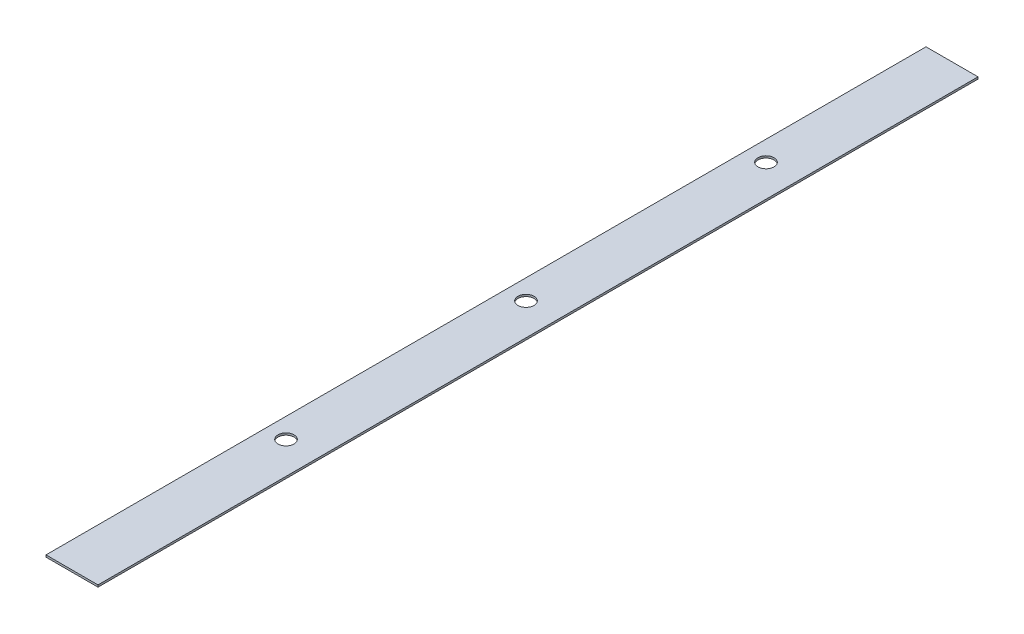
ISO-10303-21;
HEADER;
FILE_DESCRIPTION(('STEP AP214'),'2;1');
FILE_NAME('part.step','',(''),(''),'','','');
FILE_SCHEMA(('AUTOMOTIVE_DESIGN { 1 0 10303 214 1 1 1 1 }'));
ENDSEC;
DATA;
#1=APPLICATION_CONTEXT('core data for automotive mechanical design processes');
#2=APPLICATION_PROTOCOL_DEFINITION('international standard','automotive_design',2000,#1);
#3=PRODUCT_CONTEXT('',#1,'mechanical');
#4=PRODUCT('Part','Part','',(#3));
#5=PRODUCT_RELATED_PRODUCT_CATEGORY('part','',(#4));
#6=PRODUCT_DEFINITION_FORMATION('','',#4);
#7=PRODUCT_DEFINITION_CONTEXT('part definition',#1,'design');
#8=PRODUCT_DEFINITION('design','',#6,#7);
#9=PRODUCT_DEFINITION_SHAPE('','',#8);
#10=(LENGTH_UNIT() NAMED_UNIT(*) SI_UNIT(.MILLI.,.METRE.));
#11=(NAMED_UNIT(*) PLANE_ANGLE_UNIT() SI_UNIT($,.RADIAN.));
#12=(NAMED_UNIT(*) SI_UNIT($,.STERADIAN.) SOLID_ANGLE_UNIT());
#13=UNCERTAINTY_MEASURE_WITH_UNIT(LENGTH_MEASURE(1.E-05),#10,'distance_accuracy_value','');
#14=(GEOMETRIC_REPRESENTATION_CONTEXT(3) GLOBAL_UNCERTAINTY_ASSIGNED_CONTEXT((#13)) GLOBAL_UNIT_ASSIGNED_CONTEXT((#10,
#11,#12)) REPRESENTATION_CONTEXT('',''));
#15=CARTESIAN_POINT('',(0.,0.,0.));
#16=DIRECTION('',(0.,0.,1.));
#17=DIRECTION('',(1.,0.,0.));
#18=AXIS2_PLACEMENT_3D('',#15,#16,#17);
#19=CARTESIAN_POINT('',(0.,0.499999999999998,220.));
#20=DIRECTION('',(1.,0.,0.));
#21=DIRECTION('',(0.,0.,-1.));
#22=AXIS2_PLACEMENT_3D('',#19,#20,#21);
#23=PLANE('',#22);
#24=DIRECTION('',(0.,-1.,0.));
#25=VECTOR('',#24,1.);
#26=CARTESIAN_POINT('',(0.,0.499999999999998,0.));
#27=LINE('',#26,#25);
#28=CARTESIAN_POINT('',(0.,0.499999999999998,0.));
#29=VERTEX_POINT('',#28);
#30=CARTESIAN_POINT('',(0.,0.,0.));
#31=VERTEX_POINT('',#30);
#32=EDGE_CURVE('E98',#29,#31,#27,.T.);
#33=ORIENTED_EDGE('',*,*,#32,.T.);
#34=DIRECTION('',(0.,0.,-1.));
#35=VECTOR('',#34,1.);
#36=CARTESIAN_POINT('',(0.,0.,220.));
#37=LINE('',#36,#35);
#38=CARTESIAN_POINT('',(0.,0.,220.));
#39=VERTEX_POINT('',#38);
#40=EDGE_CURVE('E11',#39,#31,#37,.T.);
#41=ORIENTED_EDGE('',*,*,#40,.F.);
#42=DIRECTION('',(0.,-1.,0.));
#43=VECTOR('',#42,1.);
#44=CARTESIAN_POINT('',(0.,0.499999999999998,220.));
#45=LINE('',#44,#43);
#46=CARTESIAN_POINT('',(0.,0.499999999999998,220.));
#47=VERTEX_POINT('',#46);
#48=EDGE_CURVE('E86',#47,#39,#45,.T.);
#49=ORIENTED_EDGE('',*,*,#48,.F.);
#50=DIRECTION('',(0.,0.,-1.));
#51=VECTOR('',#50,1.);
#52=CARTESIAN_POINT('',(0.,0.499999999999998,220.));
#53=LINE('',#52,#51);
#54=EDGE_CURVE('E94',#47,#29,#53,.T.);
#55=ORIENTED_EDGE('',*,*,#54,.T.);
#56=EDGE_LOOP('',(#33,#41,#49,#55));
#57=FACE_BOUND('',#56,.T.);
#58=ADVANCED_FACE('F35',(#57),#23,.F.);
#59=CARTESIAN_POINT('',(0.,0.,220.));
#60=DIRECTION('',(0.,1.,0.));
#61=DIRECTION('',(-1.,0.,0.));
#62=AXIS2_PLACEMENT_3D('',#59,#60,#61);
#63=PLANE('',#62);
#64=CARTESIAN_POINT('',(5.00000000000126,0.,165.));
#65=DIRECTION('',(0.,1.,0.));
#66=DIRECTION('',(-1.,0.,0.));
#67=AXIS2_PLACEMENT_3D('',#64,#65,#66);
#68=CIRCLE('',#67,2.);
#69=CARTESIAN_POINT('',(3.00000000000126,0.,165.));
#70=VERTEX_POINT('',#69);
#71=EDGE_CURVE('E123',#70,#70,#68,.F.);
#72=ORIENTED_EDGE('',*,*,#71,.F.);
#73=EDGE_LOOP('',(#72));
#74=FACE_BOUND('',#73,.T.);
#75=CARTESIAN_POINT('',(5.00000000000064,0.,105.));
#76=DIRECTION('',(0.,1.,0.));
#77=DIRECTION('',(-1.,0.,0.));
#78=AXIS2_PLACEMENT_3D('',#75,#76,#77);
#79=CIRCLE('',#78,2.);
#80=CARTESIAN_POINT('',(3.00000000000063,0.,105.));
#81=VERTEX_POINT('',#80);
#82=EDGE_CURVE('E117',#81,#81,#79,.F.);
#83=ORIENTED_EDGE('',*,*,#82,.F.);
#84=EDGE_LOOP('',(#83));
#85=FACE_BOUND('',#84,.T.);
#86=CARTESIAN_POINT('',(5.00000000000001,0.,45.));
#87=DIRECTION('',(0.,1.,0.));
#88=DIRECTION('',(-1.,0.,0.));
#89=AXIS2_PLACEMENT_3D('',#86,#87,#88);
#90=CIRCLE('',#89,2.);
#91=CARTESIAN_POINT('',(3.00000000000001,0.,45.));
#92=VERTEX_POINT('',#91);
#93=EDGE_CURVE('E101',#92,#92,#90,.F.);
#94=ORIENTED_EDGE('',*,*,#93,.F.);
#95=EDGE_LOOP('',(#94));
#96=FACE_BOUND('',#95,.T.);
#97=DIRECTION('',(1.,0.,0.));
#98=VECTOR('',#97,1.);
#99=CARTESIAN_POINT('',(0.,0.,0.));
#100=LINE('',#99,#98);
#101=CARTESIAN_POINT('',(13.,0.,0.));
#102=VERTEX_POINT('',#101);
#103=EDGE_CURVE('E90',#31,#102,#100,.T.);
#104=ORIENTED_EDGE('',*,*,#103,.T.);
#105=DIRECTION('',(0.,0.,-1.));
#106=VECTOR('',#105,1.);
#107=CARTESIAN_POINT('',(13.,0.,220.));
#108=LINE('',#107,#106);
#109=CARTESIAN_POINT('',(13.,0.,220.));
#110=VERTEX_POINT('',#109);
#111=EDGE_CURVE('E43',#110,#102,#108,.T.);
#112=ORIENTED_EDGE('',*,*,#111,.F.);
#113=DIRECTION('',(1.,0.,0.));
#114=VECTOR('',#113,1.);
#115=CARTESIAN_POINT('',(0.,0.,220.));
#116=LINE('',#115,#114);
#117=EDGE_CURVE('E81',#39,#110,#116,.T.);
#118=ORIENTED_EDGE('',*,*,#117,.F.);
#119=ORIENTED_EDGE('',*,*,#40,.T.);
#120=EDGE_LOOP('',(#104,#112,#118,#119));
#121=FACE_BOUND('',#120,.T.);
#122=ADVANCED_FACE('F89',(#74,#85,#96,#121),#63,.F.);
#123=CARTESIAN_POINT('',(13.,0.499999999999998,220.));
#124=DIRECTION('',(-1.,0.,0.));
#125=DIRECTION('',(0.,0.,1.));
#126=AXIS2_PLACEMENT_3D('',#123,#124,#125);
#127=PLANE('',#126);
#128=DIRECTION('',(0.,1.,0.));
#129=VECTOR('',#128,1.);
#130=CARTESIAN_POINT('',(13.,0.499999999999998,0.));
#131=LINE('',#130,#129);
#132=CARTESIAN_POINT('',(13.,0.499999999999998,0.));
#133=VERTEX_POINT('',#132);
#134=EDGE_CURVE('E68',#102,#133,#131,.T.);
#135=ORIENTED_EDGE('',*,*,#134,.T.);
#136=DIRECTION('',(0.,0.,-1.));
#137=VECTOR('',#136,1.);
#138=CARTESIAN_POINT('',(13.,0.499999999999998,220.));
#139=LINE('',#138,#137);
#140=CARTESIAN_POINT('',(13.,0.499999999999998,220.));
#141=VERTEX_POINT('',#140);
#142=EDGE_CURVE('E91',#141,#133,#139,.T.);
#143=ORIENTED_EDGE('',*,*,#142,.F.);
#144=DIRECTION('',(0.,1.,0.));
#145=VECTOR('',#144,1.);
#146=CARTESIAN_POINT('',(13.,0.499999999999998,220.));
#147=LINE('',#146,#145);
#148=EDGE_CURVE('E84',#110,#141,#147,.T.);
#149=ORIENTED_EDGE('',*,*,#148,.F.);
#150=ORIENTED_EDGE('',*,*,#111,.T.);
#151=EDGE_LOOP('',(#135,#143,#149,#150));
#152=FACE_BOUND('',#151,.T.);
#153=ADVANCED_FACE('F92',(#152),#127,.F.);
#154=CARTESIAN_POINT('',(13.,0.499999999999998,220.));
#155=DIRECTION('',(0.,-1.,0.));
#156=DIRECTION('',(0.,0.,-1.));
#157=AXIS2_PLACEMENT_3D('',#154,#155,#156);
#158=PLANE('',#157);
#159=CARTESIAN_POINT('',(5.00000000000126,0.499999999999998,165.));
#160=DIRECTION('',(0.,1.,0.));
#161=DIRECTION('',(0.,0.,1.));
#162=AXIS2_PLACEMENT_3D('',#159,#160,#161);
#163=CIRCLE('',#162,2.);
#164=CARTESIAN_POINT('',(5.00000000000126,0.499999999999998,167.));
#165=VERTEX_POINT('',#164);
#166=EDGE_CURVE('E126',#165,#165,#163,.T.);
#167=ORIENTED_EDGE('',*,*,#166,.F.);
#168=EDGE_LOOP('',(#167));
#169=FACE_BOUND('',#168,.T.);
#170=CARTESIAN_POINT('',(5.00000000000064,0.499999999999998,105.));
#171=DIRECTION('',(0.,1.,0.));
#172=DIRECTION('',(0.,0.,1.));
#173=AXIS2_PLACEMENT_3D('',#170,#171,#172);
#174=CIRCLE('',#173,2.);
#175=CARTESIAN_POINT('',(5.00000000000064,0.499999999999998,107.));
#176=VERTEX_POINT('',#175);
#177=EDGE_CURVE('E120',#176,#176,#174,.T.);
#178=ORIENTED_EDGE('',*,*,#177,.F.);
#179=EDGE_LOOP('',(#178));
#180=FACE_BOUND('',#179,.T.);
#181=CARTESIAN_POINT('',(5.00000000000001,0.499999999999998,45.));
#182=DIRECTION('',(0.,1.,0.));
#183=DIRECTION('',(0.,0.,1.));
#184=AXIS2_PLACEMENT_3D('',#181,#182,#183);
#185=CIRCLE('',#184,2.);
#186=CARTESIAN_POINT('',(5.00000000000001,0.499999999999998,47.));
#187=VERTEX_POINT('',#186);
#188=EDGE_CURVE('E114',#187,#187,#185,.T.);
#189=ORIENTED_EDGE('',*,*,#188,.F.);
#190=EDGE_LOOP('',(#189));
#191=FACE_BOUND('',#190,.T.);
#192=DIRECTION('',(-1.,0.,0.));
#193=VECTOR('',#192,1.);
#194=CARTESIAN_POINT('',(13.,0.499999999999998,0.));
#195=LINE('',#194,#193);
#196=EDGE_CURVE('E74',#133,#29,#195,.T.);
#197=ORIENTED_EDGE('',*,*,#196,.T.);
#198=ORIENTED_EDGE('',*,*,#54,.F.);
#199=DIRECTION('',(-1.,0.,0.));
#200=VECTOR('',#199,1.);
#201=CARTESIAN_POINT('',(13.,0.499999999999998,220.));
#202=LINE('',#201,#200);
#203=EDGE_CURVE('E51',#141,#47,#202,.T.);
#204=ORIENTED_EDGE('',*,*,#203,.F.);
#205=ORIENTED_EDGE('',*,*,#142,.T.);
#206=EDGE_LOOP('',(#197,#198,#204,#205));
#207=FACE_BOUND('',#206,.T.);
#208=ADVANCED_FACE('F106',(#169,#180,#191,#207),#158,.F.);
#209=CARTESIAN_POINT('',(0.,0.,220.));
#210=DIRECTION('',(0.,0.,1.));
#211=DIRECTION('',(1.,0.,0.));
#212=AXIS2_PLACEMENT_3D('',#209,#210,#211);
#213=PLANE('',#212);
#214=ORIENTED_EDGE('',*,*,#48,.T.);
#215=ORIENTED_EDGE('',*,*,#117,.T.);
#216=ORIENTED_EDGE('',*,*,#148,.T.);
#217=ORIENTED_EDGE('',*,*,#203,.T.);
#218=EDGE_LOOP('',(#214,#215,#216,#217));
#219=FACE_BOUND('',#218,.T.);
#220=ADVANCED_FACE('F82',(#219),#213,.T.);
#221=CARTESIAN_POINT('',(0.,0.,0.));
#222=DIRECTION('',(0.,0.,1.));
#223=DIRECTION('',(1.,0.,0.));
#224=AXIS2_PLACEMENT_3D('',#221,#222,#223);
#225=PLANE('',#224);
#226=ORIENTED_EDGE('',*,*,#32,.F.);
#227=ORIENTED_EDGE('',*,*,#196,.F.);
#228=ORIENTED_EDGE('',*,*,#134,.F.);
#229=ORIENTED_EDGE('',*,*,#103,.F.);
#230=EDGE_LOOP('',(#226,#227,#228,#229));
#231=FACE_BOUND('',#230,.T.);
#232=ADVANCED_FACE('F109',(#231),#225,.F.);
#233=CARTESIAN_POINT('',(5.00000000000001,-0.00100000000000208,45.));
#234=DIRECTION('',(0.,1.,0.));
#235=DIRECTION('',(0.,0.,1.));
#236=AXIS2_PLACEMENT_3D('',#233,#234,#235);
#237=CYLINDRICAL_SURFACE('',#236,2.);
#238=ORIENTED_EDGE('',*,*,#188,.T.);
#239=EDGE_LOOP('',(#238));
#240=FACE_BOUND('',#239,.T.);
#241=ORIENTED_EDGE('',*,*,#93,.T.);
#242=EDGE_LOOP('',(#241));
#243=FACE_BOUND('',#242,.T.);
#244=ADVANCED_FACE('F140',(#240,#243),#237,.F.);
#245=CARTESIAN_POINT('',(5.00000000000064,-0.00100000000000208,105.));
#246=DIRECTION('',(0.,1.,0.));
#247=DIRECTION('',(0.,0.,1.));
#248=AXIS2_PLACEMENT_3D('',#245,#246,#247);
#249=CYLINDRICAL_SURFACE('',#248,2.);
#250=ORIENTED_EDGE('',*,*,#177,.T.);
#251=EDGE_LOOP('',(#250));
#252=FACE_BOUND('',#251,.T.);
#253=ORIENTED_EDGE('',*,*,#82,.T.);
#254=EDGE_LOOP('',(#253));
#255=FACE_BOUND('',#254,.T.);
#256=ADVANCED_FACE('F143',(#252,#255),#249,.F.);
#257=CARTESIAN_POINT('',(5.00000000000126,-0.00100000000000208,165.));
#258=DIRECTION('',(0.,1.,0.));
#259=DIRECTION('',(0.,0.,1.));
#260=AXIS2_PLACEMENT_3D('',#257,#258,#259);
#261=CYLINDRICAL_SURFACE('',#260,2.);
#262=ORIENTED_EDGE('',*,*,#166,.T.);
#263=EDGE_LOOP('',(#262));
#264=FACE_BOUND('',#263,.T.);
#265=ORIENTED_EDGE('',*,*,#71,.T.);
#266=EDGE_LOOP('',(#265));
#267=FACE_BOUND('',#266,.T.);
#268=ADVANCED_FACE('F130',(#264,#267),#261,.F.);
#269=CLOSED_SHELL('',(#58,#122,#153,#208,#220,#232,#244,#256,#268));
#270=MANIFOLD_SOLID_BREP('B2',#269);
#271=ADVANCED_BREP_SHAPE_REPRESENTATION('',(#18,#270),#14);
#272=SHAPE_DEFINITION_REPRESENTATION(#9,#271);
ENDSEC;
END-ISO-10303-21;
